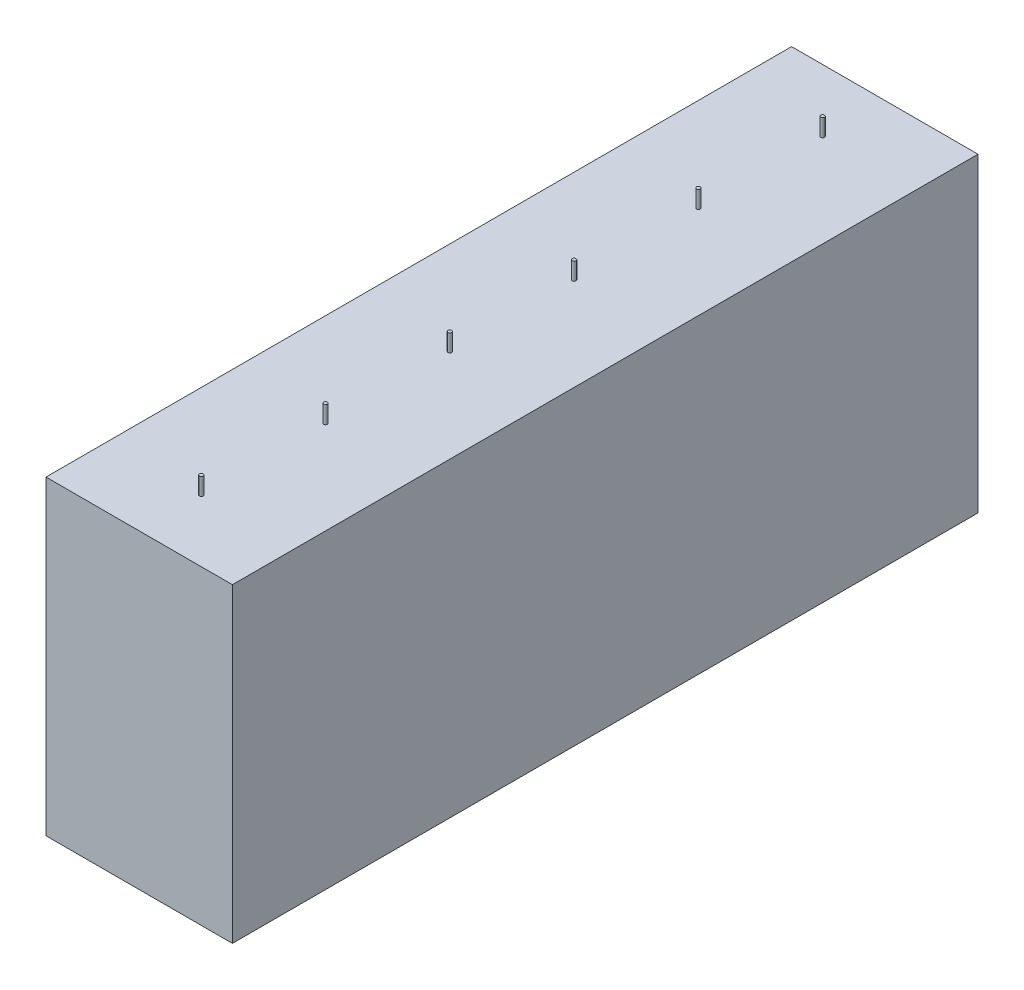
ISO-10303-21;
HEADER;
FILE_DESCRIPTION(('STEP AP214'),'2;1');
FILE_NAME('part.step','',(''),(''),'','','');
FILE_SCHEMA(('AUTOMOTIVE_DESIGN { 1 0 10303 214 1 1 1 1 }'));
ENDSEC;
DATA;
#1=APPLICATION_CONTEXT('core data for automotive mechanical design processes');
#2=APPLICATION_PROTOCOL_DEFINITION('international standard','automotive_design',2000,#1);
#3=PRODUCT_CONTEXT('',#1,'mechanical');
#4=PRODUCT('Part','Part','',(#3));
#5=PRODUCT_RELATED_PRODUCT_CATEGORY('part','',(#4));
#6=PRODUCT_DEFINITION_FORMATION('','',#4);
#7=PRODUCT_DEFINITION_CONTEXT('part definition',#1,'design');
#8=PRODUCT_DEFINITION('design','',#6,#7);
#9=PRODUCT_DEFINITION_SHAPE('','',#8);
#10=(LENGTH_UNIT() NAMED_UNIT(*) SI_UNIT(.MILLI.,.METRE.));
#11=(NAMED_UNIT(*) PLANE_ANGLE_UNIT() SI_UNIT($,.RADIAN.));
#12=(NAMED_UNIT(*) SI_UNIT($,.STERADIAN.) SOLID_ANGLE_UNIT());
#13=UNCERTAINTY_MEASURE_WITH_UNIT(LENGTH_MEASURE(1.E-05),#10,'distance_accuracy_value','');
#14=(GEOMETRIC_REPRESENTATION_CONTEXT(3) GLOBAL_UNCERTAINTY_ASSIGNED_CONTEXT((#13)) GLOBAL_UNIT_ASSIGNED_CONTEXT((#10,
#11,#12)) REPRESENTATION_CONTEXT('',''));
#15=CARTESIAN_POINT('',(0.,0.,0.));
#16=DIRECTION('',(0.,0.,1.));
#17=DIRECTION('',(1.,0.,0.));
#18=AXIS2_PLACEMENT_3D('',#15,#16,#17);
#19=CARTESIAN_POINT('',(-83.0985915492956,178.169014084507,1200.));
#20=DIRECTION('',(1.,0.,0.));
#21=DIRECTION('',(0.,1.,0.));
#22=AXIS2_PLACEMENT_3D('',#19,#20,#21);
#23=PLANE('',#22);
#24=DIRECTION('',(0.,-1.,0.));
#25=VECTOR('',#24,1.);
#26=CARTESIAN_POINT('',(-83.0985915492956,178.169014084507,0.));
#27=LINE('',#26,#25);
#28=CARTESIAN_POINT('',(-83.0985915492956,178.169014084507,0.));
#29=VERTEX_POINT('',#28);
#30=CARTESIAN_POINT('',(-83.0985915492956,-321.830985915493,0.));
#31=VERTEX_POINT('',#30);
#32=EDGE_CURVE('E110',#29,#31,#27,.T.);
#33=ORIENTED_EDGE('',*,*,#32,.T.);
#34=DIRECTION('',(0.,0.,-1.));
#35=VECTOR('',#34,1.);
#36=CARTESIAN_POINT('',(-83.0985915492956,-321.830985915493,1200.));
#37=LINE('',#36,#35);
#38=CARTESIAN_POINT('',(-83.0985915492956,-321.830985915493,1200.));
#39=VERTEX_POINT('',#38);
#40=EDGE_CURVE('E101',#39,#31,#37,.T.);
#41=ORIENTED_EDGE('',*,*,#40,.F.);
#42=DIRECTION('',(0.,-1.,0.));
#43=VECTOR('',#42,1.);
#44=CARTESIAN_POINT('',(-83.0985915492956,178.169014084507,1200.));
#45=LINE('',#44,#43);
#46=CARTESIAN_POINT('',(-83.0985915492956,178.169014084507,1200.));
#47=VERTEX_POINT('',#46);
#48=EDGE_CURVE('E95',#47,#39,#45,.T.);
#49=ORIENTED_EDGE('',*,*,#48,.F.);
#50=DIRECTION('',(0.,0.,-1.));
#51=VECTOR('',#50,1.);
#52=CARTESIAN_POINT('',(-83.0985915492956,178.169014084507,1200.));
#53=LINE('',#52,#51);
#54=EDGE_CURVE('E106',#47,#29,#53,.T.);
#55=ORIENTED_EDGE('',*,*,#54,.T.);
#56=EDGE_LOOP('',(#33,#41,#49,#55));
#57=FACE_BOUND('',#56,.T.);
#58=ADVANCED_FACE('F43',(#57),#23,.F.);
#59=CARTESIAN_POINT('',(-83.0985915492956,-321.830985915493,1200.));
#60=DIRECTION('',(0.,1.,0.));
#61=DIRECTION('',(0.,0.,1.));
#62=AXIS2_PLACEMENT_3D('',#59,#60,#61);
#63=PLANE('',#62);
#64=DIRECTION('',(1.,0.,0.));
#65=VECTOR('',#64,1.);
#66=CARTESIAN_POINT('',(-83.0985915492956,-321.830985915493,0.));
#67=LINE('',#66,#65);
#68=CARTESIAN_POINT('',(216.901408450704,-321.830985915493,0.));
#69=VERTEX_POINT('',#68);
#70=EDGE_CURVE('E100',#31,#69,#67,.T.);
#71=ORIENTED_EDGE('',*,*,#70,.T.);
#72=DIRECTION('',(0.,0.,-1.));
#73=VECTOR('',#72,1.);
#74=CARTESIAN_POINT('',(216.901408450704,-321.830985915493,1200.));
#75=LINE('',#74,#73);
#76=CARTESIAN_POINT('',(216.901408450704,-321.830985915493,1200.));
#77=VERTEX_POINT('',#76);
#78=EDGE_CURVE('E98',#77,#69,#75,.T.);
#79=ORIENTED_EDGE('',*,*,#78,.F.);
#80=DIRECTION('',(1.,0.,0.));
#81=VECTOR('',#80,1.);
#82=CARTESIAN_POINT('',(-83.0985915492956,-321.830985915493,1200.));
#83=LINE('',#82,#81);
#84=EDGE_CURVE('E90',#39,#77,#83,.T.);
#85=ORIENTED_EDGE('',*,*,#84,.F.);
#86=ORIENTED_EDGE('',*,*,#40,.T.);
#87=EDGE_LOOP('',(#71,#79,#85,#86));
#88=FACE_BOUND('',#87,.T.);
#89=ADVANCED_FACE('F99',(#88),#63,.F.);
#90=CARTESIAN_POINT('',(216.901408450704,178.169014084507,1200.));
#91=DIRECTION('',(-1.,0.,0.));
#92=DIRECTION('',(0.,-1.,0.));
#93=AXIS2_PLACEMENT_3D('',#90,#91,#92);
#94=PLANE('',#93);
#95=DIRECTION('',(0.,1.,0.));
#96=VECTOR('',#95,1.);
#97=CARTESIAN_POINT('',(216.901408450704,178.169014084507,0.));
#98=LINE('',#97,#96);
#99=CARTESIAN_POINT('',(216.901408450704,178.169014084507,0.));
#100=VERTEX_POINT('',#99);
#101=EDGE_CURVE('E76',#69,#100,#98,.T.);
#102=ORIENTED_EDGE('',*,*,#101,.T.);
#103=DIRECTION('',(0.,0.,-1.));
#104=VECTOR('',#103,1.);
#105=CARTESIAN_POINT('',(216.901408450704,178.169014084507,1200.));
#106=LINE('',#105,#104);
#107=CARTESIAN_POINT('',(216.901408450704,178.169014084507,1200.));
#108=VERTEX_POINT('',#107);
#109=EDGE_CURVE('E102',#108,#100,#106,.T.);
#110=ORIENTED_EDGE('',*,*,#109,.F.);
#111=DIRECTION('',(0.,1.,0.));
#112=VECTOR('',#111,1.);
#113=CARTESIAN_POINT('',(216.901408450704,178.169014084507,1200.));
#114=LINE('',#113,#112);
#115=EDGE_CURVE('E93',#77,#108,#114,.T.);
#116=ORIENTED_EDGE('',*,*,#115,.F.);
#117=ORIENTED_EDGE('',*,*,#78,.T.);
#118=EDGE_LOOP('',(#102,#110,#116,#117));
#119=FACE_BOUND('',#118,.T.);
#120=ADVANCED_FACE('F104',(#119),#94,.F.);
#121=CARTESIAN_POINT('',(-83.0985915492956,178.169014084507,1200.));
#122=DIRECTION('',(0.,-1.,0.));
#123=DIRECTION('',(0.,0.,-1.));
#124=AXIS2_PLACEMENT_3D('',#121,#122,#123);
#125=PLANE('',#124);
#126=CARTESIAN_POINT('',(66.9014084507043,178.169014084507,100.));
#127=DIRECTION('',(0.,-1.,0.));
#128=DIRECTION('',(0.,0.,-1.));
#129=AXIS2_PLACEMENT_3D('',#126,#127,#128);
#130=CIRCLE('',#129,3.00000000000001);
#131=CARTESIAN_POINT('',(66.9014084507043,178.169014084507,97.));
#132=VERTEX_POINT('',#131);
#133=EDGE_CURVE('E11',#132,#132,#130,.F.);
#134=ORIENTED_EDGE('',*,*,#133,.F.);
#135=EDGE_LOOP('',(#134));
#136=FACE_BOUND('',#135,.T.);
#137=CARTESIAN_POINT('',(66.9014084507043,178.169014084507,300.));
#138=DIRECTION('',(0.,-1.,0.));
#139=DIRECTION('',(0.,0.,-1.));
#140=AXIS2_PLACEMENT_3D('',#137,#138,#139);
#141=CIRCLE('',#140,3.00000000000001);
#142=CARTESIAN_POINT('',(66.9014084507043,178.169014084507,297.));
#143=VERTEX_POINT('',#142);
#144=EDGE_CURVE('E51',#143,#143,#141,.F.);
#145=ORIENTED_EDGE('',*,*,#144,.F.);
#146=EDGE_LOOP('',(#145));
#147=FACE_BOUND('',#146,.T.);
#148=CARTESIAN_POINT('',(66.9014084507043,178.169014084507,500.));
#149=DIRECTION('',(0.,-1.,0.));
#150=DIRECTION('',(0.,0.,-1.));
#151=AXIS2_PLACEMENT_3D('',#148,#149,#150);
#152=CIRCLE('',#151,3.00000000000001);
#153=CARTESIAN_POINT('',(66.9014084507043,178.169014084507,497.));
#154=VERTEX_POINT('',#153);
#155=EDGE_CURVE('E129',#154,#154,#152,.F.);
#156=ORIENTED_EDGE('',*,*,#155,.F.);
#157=EDGE_LOOP('',(#156));
#158=FACE_BOUND('',#157,.T.);
#159=CARTESIAN_POINT('',(66.9014084507043,178.169014084507,700.));
#160=DIRECTION('',(0.,-1.,0.));
#161=DIRECTION('',(0.,0.,-1.));
#162=AXIS2_PLACEMENT_3D('',#159,#160,#161);
#163=CIRCLE('',#162,3.00000000000001);
#164=CARTESIAN_POINT('',(66.9014084507043,178.169014084507,697.));
#165=VERTEX_POINT('',#164);
#166=EDGE_CURVE('E126',#165,#165,#163,.F.);
#167=ORIENTED_EDGE('',*,*,#166,.F.);
#168=EDGE_LOOP('',(#167));
#169=FACE_BOUND('',#168,.T.);
#170=CARTESIAN_POINT('',(66.9014084507043,178.169014084507,900.));
#171=DIRECTION('',(0.,-1.,0.));
#172=DIRECTION('',(0.,0.,-1.));
#173=AXIS2_PLACEMENT_3D('',#170,#171,#172);
#174=CIRCLE('',#173,3.00000000000001);
#175=CARTESIAN_POINT('',(66.9014084507043,178.169014084507,897.));
#176=VERTEX_POINT('',#175);
#177=EDGE_CURVE('E123',#176,#176,#174,.F.);
#178=ORIENTED_EDGE('',*,*,#177,.F.);
#179=EDGE_LOOP('',(#178));
#180=FACE_BOUND('',#179,.T.);
#181=CARTESIAN_POINT('',(66.9014084507043,178.169014084507,1100.));
#182=DIRECTION('',(0.,-1.,0.));
#183=DIRECTION('',(0.,0.,-1.));
#184=AXIS2_PLACEMENT_3D('',#181,#182,#183);
#185=CIRCLE('',#184,3.00000000000001);
#186=CARTESIAN_POINT('',(66.9014084507043,178.169014084507,1097.));
#187=VERTEX_POINT('',#186);
#188=EDGE_CURVE('E120',#187,#187,#185,.F.);
#189=ORIENTED_EDGE('',*,*,#188,.F.);
#190=EDGE_LOOP('',(#189));
#191=FACE_BOUND('',#190,.T.);
#192=DIRECTION('',(-1.,0.,0.));
#193=VECTOR('',#192,1.);
#194=CARTESIAN_POINT('',(-83.0985915492956,178.169014084507,0.));
#195=LINE('',#194,#193);
#196=EDGE_CURVE('E82',#100,#29,#195,.T.);
#197=ORIENTED_EDGE('',*,*,#196,.T.);
#198=ORIENTED_EDGE('',*,*,#54,.F.);
#199=DIRECTION('',(-1.,0.,0.));
#200=VECTOR('',#199,1.);
#201=CARTESIAN_POINT('',(-83.0985915492956,178.169014084507,1200.));
#202=LINE('',#201,#200);
#203=EDGE_CURVE('E59',#108,#47,#202,.T.);
#204=ORIENTED_EDGE('',*,*,#203,.F.);
#205=ORIENTED_EDGE('',*,*,#109,.T.);
#206=EDGE_LOOP('',(#197,#198,#204,#205));
#207=FACE_BOUND('',#206,.T.);
#208=ADVANCED_FACE('F136',(#136,#147,#158,#169,#180,#191,#207),#125,.F.);
#209=CARTESIAN_POINT('',(0.,0.,1200.));
#210=DIRECTION('',(0.,0.,1.));
#211=DIRECTION('',(1.,0.,0.));
#212=AXIS2_PLACEMENT_3D('',#209,#210,#211);
#213=PLANE('',#212);
#214=ORIENTED_EDGE('',*,*,#48,.T.);
#215=ORIENTED_EDGE('',*,*,#84,.T.);
#216=ORIENTED_EDGE('',*,*,#115,.T.);
#217=ORIENTED_EDGE('',*,*,#203,.T.);
#218=EDGE_LOOP('',(#214,#215,#216,#217));
#219=FACE_BOUND('',#218,.T.);
#220=ADVANCED_FACE('F91',(#219),#213,.T.);
#221=CARTESIAN_POINT('',(0.,0.,0.));
#222=DIRECTION('',(0.,0.,1.));
#223=DIRECTION('',(1.,0.,0.));
#224=AXIS2_PLACEMENT_3D('',#221,#222,#223);
#225=PLANE('',#224);
#226=ORIENTED_EDGE('',*,*,#32,.F.);
#227=ORIENTED_EDGE('',*,*,#196,.F.);
#228=ORIENTED_EDGE('',*,*,#101,.F.);
#229=ORIENTED_EDGE('',*,*,#70,.F.);
#230=EDGE_LOOP('',(#226,#227,#228,#229));
#231=FACE_BOUND('',#230,.T.);
#232=ADVANCED_FACE('F152',(#231),#225,.F.);
#233=CARTESIAN_POINT('',(66.9014084507043,206.169014084507,1100.));
#234=DIRECTION('',(0.,-1.,0.));
#235=DIRECTION('',(0.,0.,-1.));
#236=AXIS2_PLACEMENT_3D('',#233,#234,#235);
#237=CYLINDRICAL_SURFACE('',#236,3.00000000000001);
#238=CARTESIAN_POINT('',(66.9014084507043,206.169014084507,1100.));
#239=DIRECTION('',(0.,1.,0.));
#240=DIRECTION('',(0.,0.,1.));
#241=AXIS2_PLACEMENT_3D('',#238,#239,#240);
#242=CIRCLE('',#241,3.00000000000001);
#243=CARTESIAN_POINT('',(66.9014084507043,206.169014084507,1103.));
#244=VERTEX_POINT('',#243);
#245=EDGE_CURVE('E173',#244,#244,#242,.T.);
#246=ORIENTED_EDGE('',*,*,#245,.F.);
#247=EDGE_LOOP('',(#246));
#248=FACE_BOUND('',#247,.T.);
#249=ORIENTED_EDGE('',*,*,#188,.T.);
#250=EDGE_LOOP('',(#249));
#251=FACE_BOUND('',#250,.T.);
#252=ADVANCED_FACE('F149',(#248,#251),#237,.T.);
#253=CARTESIAN_POINT('',(66.9014084507043,206.169014084507,1100.));
#254=DIRECTION('',(0.,1.,0.));
#255=DIRECTION('',(0.,0.,1.));
#256=AXIS2_PLACEMENT_3D('',#253,#254,#255);
#257=PLANE('',#256);
#258=ORIENTED_EDGE('',*,*,#245,.T.);
#259=EDGE_LOOP('',(#258));
#260=FACE_BOUND('',#259,.T.);
#261=ADVANCED_FACE('F151',(#260),#257,.T.);
#262=CARTESIAN_POINT('',(66.9014084507043,206.169014084507,900.));
#263=DIRECTION('',(0.,-1.,0.));
#264=DIRECTION('',(0.,0.,-1.));
#265=AXIS2_PLACEMENT_3D('',#262,#263,#264);
#266=CYLINDRICAL_SURFACE('',#265,3.00000000000001);
#267=CARTESIAN_POINT('',(66.9014084507043,206.169014084507,900.));
#268=DIRECTION('',(0.,1.,0.));
#269=DIRECTION('',(0.,0.,1.));
#270=AXIS2_PLACEMENT_3D('',#267,#268,#269);
#271=CIRCLE('',#270,3.00000000000001);
#272=CARTESIAN_POINT('',(66.9014084507043,206.169014084507,903.));
#273=VERTEX_POINT('',#272);
#274=EDGE_CURVE('E176',#273,#273,#271,.T.);
#275=ORIENTED_EDGE('',*,*,#274,.F.);
#276=EDGE_LOOP('',(#275));
#277=FACE_BOUND('',#276,.T.);
#278=ORIENTED_EDGE('',*,*,#177,.T.);
#279=EDGE_LOOP('',(#278));
#280=FACE_BOUND('',#279,.T.);
#281=ADVANCED_FACE('F158',(#277,#280),#266,.T.);
#282=CARTESIAN_POINT('',(66.9014084507043,206.169014084507,900.));
#283=DIRECTION('',(0.,1.,0.));
#284=DIRECTION('',(0.,0.,1.));
#285=AXIS2_PLACEMENT_3D('',#282,#283,#284);
#286=PLANE('',#285);
#287=ORIENTED_EDGE('',*,*,#274,.T.);
#288=EDGE_LOOP('',(#287));
#289=FACE_BOUND('',#288,.T.);
#290=ADVANCED_FACE('F222',(#289),#286,.T.);
#291=CARTESIAN_POINT('',(66.9014084507043,206.169014084507,700.));
#292=DIRECTION('',(0.,-1.,0.));
#293=DIRECTION('',(0.,0.,-1.));
#294=AXIS2_PLACEMENT_3D('',#291,#292,#293);
#295=CYLINDRICAL_SURFACE('',#294,3.00000000000001);
#296=CARTESIAN_POINT('',(66.9014084507043,206.169014084507,700.));
#297=DIRECTION('',(0.,1.,0.));
#298=DIRECTION('',(0.,0.,1.));
#299=AXIS2_PLACEMENT_3D('',#296,#297,#298);
#300=CIRCLE('',#299,3.00000000000001);
#301=CARTESIAN_POINT('',(66.9014084507043,206.169014084507,703.));
#302=VERTEX_POINT('',#301);
#303=EDGE_CURVE('E179',#302,#302,#300,.T.);
#304=ORIENTED_EDGE('',*,*,#303,.F.);
#305=EDGE_LOOP('',(#304));
#306=FACE_BOUND('',#305,.T.);
#307=ORIENTED_EDGE('',*,*,#166,.T.);
#308=EDGE_LOOP('',(#307));
#309=FACE_BOUND('',#308,.T.);
#310=ADVANCED_FACE('F219',(#306,#309),#295,.T.);
#311=CARTESIAN_POINT('',(66.9014084507043,206.169014084507,700.));
#312=DIRECTION('',(0.,1.,0.));
#313=DIRECTION('',(0.,0.,1.));
#314=AXIS2_PLACEMENT_3D('',#311,#312,#313);
#315=PLANE('',#314);
#316=ORIENTED_EDGE('',*,*,#303,.T.);
#317=EDGE_LOOP('',(#316));
#318=FACE_BOUND('',#317,.T.);
#319=ADVANCED_FACE('F214',(#318),#315,.T.);
#320=CARTESIAN_POINT('',(66.9014084507043,206.169014084507,500.));
#321=DIRECTION('',(0.,-1.,0.));
#322=DIRECTION('',(0.,0.,-1.));
#323=AXIS2_PLACEMENT_3D('',#320,#321,#322);
#324=CYLINDRICAL_SURFACE('',#323,3.00000000000001);
#325=CARTESIAN_POINT('',(66.9014084507043,206.169014084507,500.));
#326=DIRECTION('',(0.,1.,0.));
#327=DIRECTION('',(0.,0.,1.));
#328=AXIS2_PLACEMENT_3D('',#325,#326,#327);
#329=CIRCLE('',#328,3.00000000000001);
#330=CARTESIAN_POINT('',(66.9014084507043,206.169014084507,503.));
#331=VERTEX_POINT('',#330);
#332=EDGE_CURVE('E182',#331,#331,#329,.T.);
#333=ORIENTED_EDGE('',*,*,#332,.F.);
#334=EDGE_LOOP('',(#333));
#335=FACE_BOUND('',#334,.T.);
#336=ORIENTED_EDGE('',*,*,#155,.T.);
#337=EDGE_LOOP('',(#336));
#338=FACE_BOUND('',#337,.T.);
#339=ADVANCED_FACE('F211',(#335,#338),#324,.T.);
#340=CARTESIAN_POINT('',(66.9014084507043,206.169014084507,500.));
#341=DIRECTION('',(0.,1.,0.));
#342=DIRECTION('',(0.,0.,1.));
#343=AXIS2_PLACEMENT_3D('',#340,#341,#342);
#344=PLANE('',#343);
#345=ORIENTED_EDGE('',*,*,#332,.T.);
#346=EDGE_LOOP('',(#345));
#347=FACE_BOUND('',#346,.T.);
#348=ADVANCED_FACE('F208',(#347),#344,.T.);
#349=CARTESIAN_POINT('',(66.9014084507043,206.169014084507,300.));
#350=DIRECTION('',(0.,-1.,0.));
#351=DIRECTION('',(0.,0.,-1.));
#352=AXIS2_PLACEMENT_3D('',#349,#350,#351);
#353=CYLINDRICAL_SURFACE('',#352,3.00000000000001);
#354=CARTESIAN_POINT('',(66.9014084507043,206.169014084507,300.));
#355=DIRECTION('',(0.,1.,0.));
#356=DIRECTION('',(0.,0.,1.));
#357=AXIS2_PLACEMENT_3D('',#354,#355,#356);
#358=CIRCLE('',#357,3.00000000000001);
#359=CARTESIAN_POINT('',(66.9014084507043,206.169014084507,303.));
#360=VERTEX_POINT('',#359);
#361=EDGE_CURVE('E185',#360,#360,#358,.T.);
#362=ORIENTED_EDGE('',*,*,#361,.F.);
#363=EDGE_LOOP('',(#362));
#364=FACE_BOUND('',#363,.T.);
#365=ORIENTED_EDGE('',*,*,#144,.T.);
#366=EDGE_LOOP('',(#365));
#367=FACE_BOUND('',#366,.T.);
#368=ADVANCED_FACE('F134',(#364,#367),#353,.T.);
#369=CARTESIAN_POINT('',(66.9014084507043,206.169014084507,300.));
#370=DIRECTION('',(0.,1.,0.));
#371=DIRECTION('',(0.,0.,1.));
#372=AXIS2_PLACEMENT_3D('',#369,#370,#371);
#373=PLANE('',#372);
#374=ORIENTED_EDGE('',*,*,#361,.T.);
#375=EDGE_LOOP('',(#374));
#376=FACE_BOUND('',#375,.T.);
#377=ADVANCED_FACE('F196',(#376),#373,.T.);
#378=CARTESIAN_POINT('',(66.9014084507043,206.169014084507,100.));
#379=DIRECTION('',(0.,-1.,0.));
#380=DIRECTION('',(0.,0.,-1.));
#381=AXIS2_PLACEMENT_3D('',#378,#379,#380);
#382=CYLINDRICAL_SURFACE('',#381,3.00000000000001);
#383=CARTESIAN_POINT('',(66.9014084507043,206.169014084507,100.));
#384=DIRECTION('',(0.,1.,0.));
#385=DIRECTION('',(0.,0.,1.));
#386=AXIS2_PLACEMENT_3D('',#383,#384,#385);
#387=CIRCLE('',#386,3.00000000000001);
#388=CARTESIAN_POINT('',(66.9014084507043,206.169014084507,103.));
#389=VERTEX_POINT('',#388);
#390=EDGE_CURVE('E113',#389,#389,#387,.T.);
#391=ORIENTED_EDGE('',*,*,#390,.F.);
#392=EDGE_LOOP('',(#391));
#393=FACE_BOUND('',#392,.T.);
#394=ORIENTED_EDGE('',*,*,#133,.T.);
#395=EDGE_LOOP('',(#394));
#396=FACE_BOUND('',#395,.T.);
#397=ADVANCED_FACE('F193',(#393,#396),#382,.T.);
#398=CARTESIAN_POINT('',(66.9014084507043,206.169014084507,100.));
#399=DIRECTION('',(0.,1.,0.));
#400=DIRECTION('',(0.,0.,1.));
#401=AXIS2_PLACEMENT_3D('',#398,#399,#400);
#402=PLANE('',#401);
#403=ORIENTED_EDGE('',*,*,#390,.T.);
#404=EDGE_LOOP('',(#403));
#405=FACE_BOUND('',#404,.T.);
#406=ADVANCED_FACE('F191',(#405),#402,.T.);
#407=CLOSED_SHELL('',(#58,#89,#120,#208,#220,#232,#252,#261,#281,#290,#310,#319,#339,#348,#368,
#377,#397,#406));
#408=MANIFOLD_SOLID_BREP('B2',#407);
#409=ADVANCED_BREP_SHAPE_REPRESENTATION('',(#18,#408),#14);
#410=SHAPE_DEFINITION_REPRESENTATION(#9,#409);
ENDSEC;
END-ISO-10303-21;
